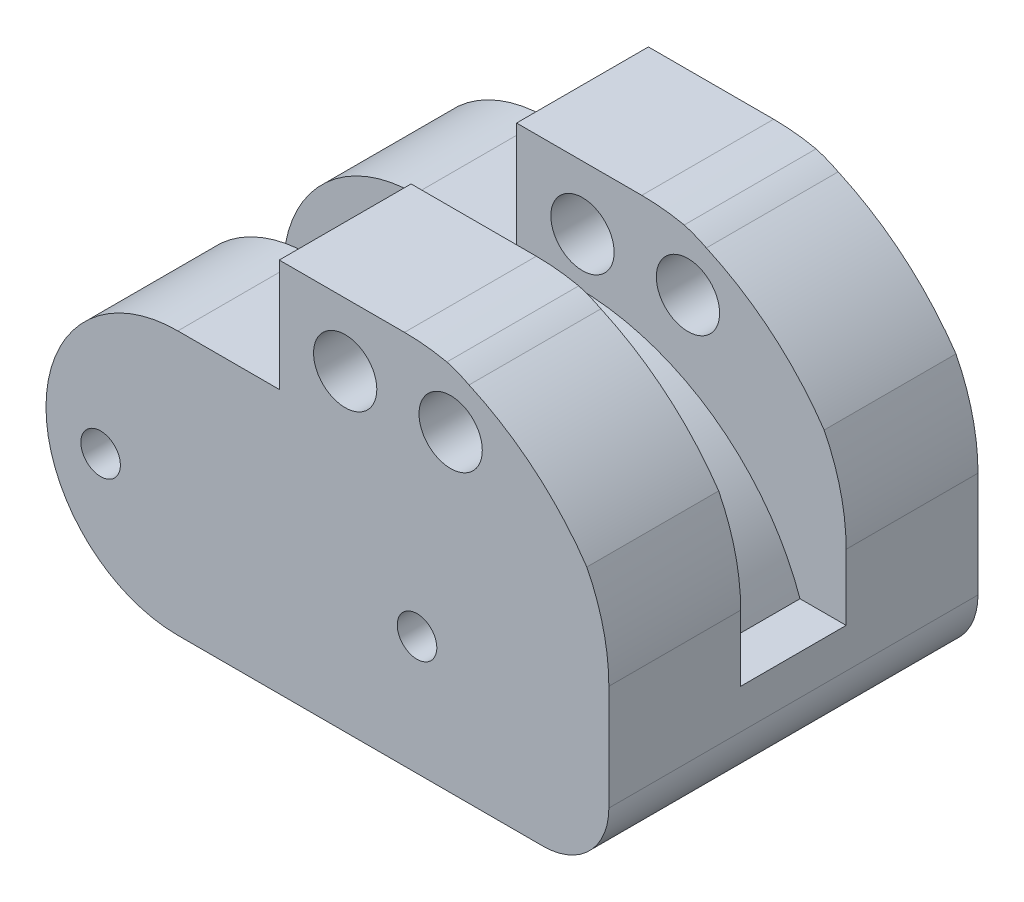
ISO-10303-21;
HEADER;
FILE_DESCRIPTION(('STEP AP214'),'2;1');
FILE_NAME('part.step','',(''),(''),'','','');
FILE_SCHEMA(('AUTOMOTIVE_DESIGN { 1 0 10303 214 1 1 1 1 }'));
ENDSEC;
DATA;
#1=APPLICATION_CONTEXT('core data for automotive mechanical design processes');
#2=APPLICATION_PROTOCOL_DEFINITION('international standard','automotive_design',2000,#1);
#3=PRODUCT_CONTEXT('',#1,'mechanical');
#4=PRODUCT('Part','Part','',(#3));
#5=PRODUCT_RELATED_PRODUCT_CATEGORY('part','',(#4));
#6=PRODUCT_DEFINITION_FORMATION('','',#4);
#7=PRODUCT_DEFINITION_CONTEXT('part definition',#1,'design');
#8=PRODUCT_DEFINITION('design','',#6,#7);
#9=PRODUCT_DEFINITION_SHAPE('','',#8);
#10=(LENGTH_UNIT() NAMED_UNIT(*) SI_UNIT(.MILLI.,.METRE.));
#11=(NAMED_UNIT(*) PLANE_ANGLE_UNIT() SI_UNIT($,.RADIAN.));
#12=(NAMED_UNIT(*) SI_UNIT($,.STERADIAN.) SOLID_ANGLE_UNIT());
#13=UNCERTAINTY_MEASURE_WITH_UNIT(LENGTH_MEASURE(1.E-05),#10,'distance_accuracy_value','');
#14=(GEOMETRIC_REPRESENTATION_CONTEXT(3) GLOBAL_UNCERTAINTY_ASSIGNED_CONTEXT((#13)) GLOBAL_UNIT_ASSIGNED_CONTEXT((#10,
#11,#12)) REPRESENTATION_CONTEXT('',''));
#15=CARTESIAN_POINT('',(0.,0.,0.));
#16=DIRECTION('',(0.,0.,1.));
#17=DIRECTION('',(1.,0.,0.));
#18=AXIS2_PLACEMENT_3D('',#15,#16,#17);
#19=CARTESIAN_POINT('',(0.,20.,0.));
#20=DIRECTION('',(0.,0.,-1.));
#21=DIRECTION('',(-1.,0.,0.));
#22=AXIS2_PLACEMENT_3D('',#19,#20,#21);
#23=PLANE('',#22);
#24=CARTESIAN_POINT('',(60.4498743710662,9.,0.));
#25=DIRECTION('',(0.,0.,-1.));
#26=DIRECTION('',(-1.,0.,0.));
#27=AXIS2_PLACEMENT_3D('',#24,#25,#26);
#28=CIRCLE('',#27,1.5);
#29=CARTESIAN_POINT('',(58.9498743710662,9.,0.));
#30=VERTEX_POINT('',#29);
#31=EDGE_CURVE('E511',#30,#30,#28,.T.);
#32=ORIENTED_EDGE('',*,*,#31,.T.);
#33=EDGE_LOOP('',(#32));
#34=FACE_BOUND('',#33,.T.);
#35=CARTESIAN_POINT('',(36.4498743710662,9.,0.));
#36=DIRECTION('',(0.,0.,-1.));
#37=DIRECTION('',(-1.,0.,0.));
#38=AXIS2_PLACEMENT_3D('',#35,#36,#37);
#39=CIRCLE('',#38,1.5);
#40=CARTESIAN_POINT('',(34.9498743710662,9.,0.));
#41=VERTEX_POINT('',#40);
#42=EDGE_CURVE('E518',#41,#41,#39,.T.);
#43=ORIENTED_EDGE('',*,*,#42,.T.);
#44=EDGE_LOOP('',(#43));
#45=FACE_BOUND('',#44,.T.);
#46=CARTESIAN_POINT('',(55.,23.7,0.));
#47=DIRECTION('',(0.,0.,1.));
#48=DIRECTION('',(1.,0.,0.));
#49=AXIS2_PLACEMENT_3D('',#46,#47,#48);
#50=CIRCLE('',#49,2.4);
#51=CARTESIAN_POINT('',(57.4,23.7,0.));
#52=VERTEX_POINT('',#51);
#53=EDGE_CURVE('E373',#52,#52,#50,.T.);
#54=ORIENTED_EDGE('',*,*,#53,.F.);
#55=EDGE_LOOP('',(#54));
#56=FACE_BOUND('',#55,.T.);
#57=CARTESIAN_POINT('',(63.,23.7,0.));
#58=DIRECTION('',(0.,0.,1.));
#59=DIRECTION('',(1.,0.,0.));
#60=AXIS2_PLACEMENT_3D('',#57,#58,#59);
#61=CIRCLE('',#60,2.4);
#62=CARTESIAN_POINT('',(65.4,23.7,0.));
#63=VERTEX_POINT('',#62);
#64=EDGE_CURVE('E378',#63,#63,#61,.T.);
#65=ORIENTED_EDGE('',*,*,#64,.F.);
#66=EDGE_LOOP('',(#65));
#67=FACE_BOUND('',#66,.T.);
#68=CARTESIAN_POINT('',(42.3077387473353,10.,0.));
#69=DIRECTION('',(0.,0.,-1.));
#70=DIRECTION('',(-1.,0.,0.));
#71=AXIS2_PLACEMENT_3D('',#68,#69,#70);
#72=CIRCLE('',#71,10.);
#73=CARTESIAN_POINT('',(42.3077387473353,20.,0.));
#74=VERTEX_POINT('',#73);
#75=CARTESIAN_POINT('',(32.3077387473353,10.,0.));
#76=VERTEX_POINT('',#75);
#77=EDGE_CURVE('E323',#74,#76,#72,.F.);
#78=ORIENTED_EDGE('',*,*,#77,.T.);
#79=CARTESIAN_POINT('',(42.3077387473353,10.,0.));
#80=DIRECTION('',(0.,0.,-1.));
#81=DIRECTION('',(-1.,0.,0.));
#82=AXIS2_PLACEMENT_3D('',#79,#80,#81);
#83=CIRCLE('',#82,10.);
#84=CARTESIAN_POINT('',(42.3077387473353,0.,0.));
#85=VERTEX_POINT('',#84);
#86=EDGE_CURVE('E325',#76,#85,#83,.F.);
#87=ORIENTED_EDGE('',*,*,#86,.T.);
#88=DIRECTION('',(1.,0.,0.));
#89=VECTOR('',#88,1.);
#90=CARTESIAN_POINT('',(0.,0.,0.));
#91=LINE('',#90,#89);
#92=CARTESIAN_POINT('',(70.,0.,0.));
#93=VERTEX_POINT('',#92);
#94=EDGE_CURVE('E413',#85,#93,#91,.T.);
#95=ORIENTED_EDGE('',*,*,#94,.T.);
#96=CARTESIAN_POINT('',(70.,5.,0.));
#97=DIRECTION('',(0.,0.,-1.));
#98=DIRECTION('',(-1.,0.,0.));
#99=AXIS2_PLACEMENT_3D('',#96,#97,#98);
#100=CIRCLE('',#99,5.);
#101=CARTESIAN_POINT('',(75.,5.,0.));
#102=VERTEX_POINT('',#101);
#103=EDGE_CURVE('E310',#93,#102,#100,.F.);
#104=ORIENTED_EDGE('',*,*,#103,.T.);
#105=DIRECTION('',(0.,-1.,0.));
#106=VECTOR('',#105,1.);
#107=CARTESIAN_POINT('',(75.,20.,0.));
#108=LINE('',#107,#106);
#109=CARTESIAN_POINT('',(75.,13.,0.));
#110=VERTEX_POINT('',#109);
#111=EDGE_CURVE('E421',#110,#102,#108,.T.);
#112=ORIENTED_EDGE('',*,*,#111,.F.);
#113=CARTESIAN_POINT('',(59.5,13.,0.));
#114=DIRECTION('',(0.,0.,-1.));
#115=DIRECTION('',(-1.,0.,0.));
#116=AXIS2_PLACEMENT_3D('',#113,#114,#115);
#117=CIRCLE('',#116,15.5);
#118=CARTESIAN_POINT('',(73.3293166859393,20.,0.));
#119=VERTEX_POINT('',#118);
#120=EDGE_CURVE('E448',#110,#119,#117,.F.);
#121=ORIENTED_EDGE('',*,*,#120,.T.);
#122=CARTESIAN_POINT('',(55.618124304324,7.95300600060694,0.));
#123=DIRECTION('',(0.,0.,1.));
#124=DIRECTION('',(1.,0.,0.));
#125=AXIS2_PLACEMENT_3D('',#122,#123,#124);
#126=CIRCLE('',#125,21.42);
#127=CARTESIAN_POINT('',(64.3962847495218,27.4916932440828,0.));
#128=VERTEX_POINT('',#127);
#129=EDGE_CURVE('E592',#119,#128,#126,.T.);
#130=ORIENTED_EDGE('',*,*,#129,.T.);
#131=CARTESIAN_POINT('',(60.1646583429696,19.3353416570303,0.));
#132=DIRECTION('',(0.,0.,-1.));
#133=DIRECTION('',(-1.,0.,0.));
#134=AXIS2_PLACEMENT_3D('',#131,#132,#133);
#135=CIRCLE('',#134,9.18872859846472);
#136=CARTESIAN_POINT('',(62.7168890542947,28.1625072073308,0.));
#137=VERTEX_POINT('',#136);
#138=EDGE_CURVE('E491',#128,#137,#135,.F.);
#139=ORIENTED_EDGE('',*,*,#138,.T.);
#140=CARTESIAN_POINT('',(59.5,28.5,0.));
#141=VERTEX_POINT('',#140);
#142=EDGE_CURVE('E487',#137,#141,#117,.F.);
#143=ORIENTED_EDGE('',*,*,#142,.T.);
#144=DIRECTION('',(1.,0.,0.));
#145=VECTOR('',#144,1.);
#146=CARTESIAN_POINT('',(0.,28.5,0.));
#147=LINE('',#146,#145);
#148=CARTESIAN_POINT('',(50.,28.5,0.));
#149=VERTEX_POINT('',#148);
#150=EDGE_CURVE('E404',#149,#141,#147,.T.);
#151=ORIENTED_EDGE('',*,*,#150,.F.);
#152=DIRECTION('',(0.,1.,0.));
#153=VECTOR('',#152,1.);
#154=CARTESIAN_POINT('',(50.,20.,0.));
#155=LINE('',#154,#153);
#156=CARTESIAN_POINT('',(50.,20.,0.));
#157=VERTEX_POINT('',#156);
#158=EDGE_CURVE('E355',#157,#149,#155,.T.);
#159=ORIENTED_EDGE('',*,*,#158,.F.);
#160=DIRECTION('',(1.,0.,0.));
#161=VECTOR('',#160,1.);
#162=CARTESIAN_POINT('',(0.,20.,0.));
#163=LINE('',#162,#161);
#164=EDGE_CURVE('E349',#74,#157,#163,.T.);
#165=ORIENTED_EDGE('',*,*,#164,.F.);
#166=EDGE_LOOP('',(#78,#87,#95,#104,#112,#121,#130,#139,#143,#151,#159,#165));
#167=FACE_BOUND('',#166,.T.);
#168=ADVANCED_FACE('F71',(#34,#45,#56,#67,#167),#23,.F.);
#169=CARTESIAN_POINT('',(0.,28.5,-10.));
#170=DIRECTION('',(0.,0.,1.));
#171=DIRECTION('',(1.,0.,0.));
#172=AXIS2_PLACEMENT_3D('',#169,#170,#171);
#173=PLANE('',#172);
#174=CARTESIAN_POINT('',(55.,23.7,-10.));
#175=DIRECTION('',(0.,0.,1.));
#176=DIRECTION('',(1.,0.,0.));
#177=AXIS2_PLACEMENT_3D('',#174,#175,#176);
#178=CIRCLE('',#177,2.4);
#179=CARTESIAN_POINT('',(57.4,23.7,-10.));
#180=VERTEX_POINT('',#179);
#181=EDGE_CURVE('E386',#180,#180,#178,.T.);
#182=ORIENTED_EDGE('',*,*,#181,.T.);
#183=EDGE_LOOP('',(#182));
#184=FACE_BOUND('',#183,.T.);
#185=CARTESIAN_POINT('',(63.,23.7,-10.));
#186=DIRECTION('',(0.,0.,1.));
#187=DIRECTION('',(1.,0.,0.));
#188=AXIS2_PLACEMENT_3D('',#185,#186,#187);
#189=CIRCLE('',#188,2.4);
#190=CARTESIAN_POINT('',(65.4,23.7,-10.));
#191=VERTEX_POINT('',#190);
#192=EDGE_CURVE('E390',#191,#191,#189,.T.);
#193=ORIENTED_EDGE('',*,*,#192,.T.);
#194=EDGE_LOOP('',(#193));
#195=FACE_BOUND('',#194,.T.);
#196=CARTESIAN_POINT('',(36.4498743710662,9.,-10.));
#197=DIRECTION('',(0.,0.,1.));
#198=DIRECTION('',(1.,0.,0.));
#199=AXIS2_PLACEMENT_3D('',#196,#197,#198);
#200=CIRCLE('',#199,1.5);
#201=CARTESIAN_POINT('',(37.9498743710662,9.,-10.));
#202=VERTEX_POINT('',#201);
#203=EDGE_CURVE('E514',#202,#202,#200,.T.);
#204=ORIENTED_EDGE('',*,*,#203,.T.);
#205=EDGE_LOOP('',(#204));
#206=FACE_BOUND('',#205,.T.);
#207=DIRECTION('',(-1.,0.,0.));
#208=VECTOR('',#207,1.);
#209=CARTESIAN_POINT('',(0.,0.,-9.99999999999999));
#210=LINE('',#209,#208);
#211=CARTESIAN_POINT('',(60.,0.,-10.));
#212=VERTEX_POINT('',#211);
#213=CARTESIAN_POINT('',(42.3077387473353,0.,-10.));
#214=VERTEX_POINT('',#213);
#215=EDGE_CURVE('E284',#212,#214,#210,.T.);
#216=ORIENTED_EDGE('',*,*,#215,.T.);
#217=CARTESIAN_POINT('',(42.3077387473353,10.,-10.));
#218=DIRECTION('',(0.,0.,1.));
#219=DIRECTION('',(1.,0.,0.));
#220=AXIS2_PLACEMENT_3D('',#217,#218,#219);
#221=CIRCLE('',#220,10.);
#222=CARTESIAN_POINT('',(32.3077387473353,10.,-10.));
#223=VERTEX_POINT('',#222);
#224=EDGE_CURVE('E93',#214,#223,#221,.F.);
#225=ORIENTED_EDGE('',*,*,#224,.T.);
#226=CARTESIAN_POINT('',(42.3077387473353,10.,-10.));
#227=DIRECTION('',(0.,0.,1.));
#228=DIRECTION('',(1.,0.,0.));
#229=AXIS2_PLACEMENT_3D('',#226,#227,#228);
#230=CIRCLE('',#229,10.);
#231=CARTESIAN_POINT('',(42.3077387473353,20.,-10.));
#232=VERTEX_POINT('',#231);
#233=EDGE_CURVE('E88',#223,#232,#230,.F.);
#234=ORIENTED_EDGE('',*,*,#233,.T.);
#235=DIRECTION('',(1.,0.,0.));
#236=VECTOR('',#235,1.);
#237=CARTESIAN_POINT('',(50.,20.,-10.));
#238=LINE('',#237,#236);
#239=CARTESIAN_POINT('',(50.,20.,-10.));
#240=VERTEX_POINT('',#239);
#241=EDGE_CURVE('E351',#232,#240,#238,.T.);
#242=ORIENTED_EDGE('',*,*,#241,.T.);
#243=DIRECTION('',(0.,-1.,0.));
#244=VECTOR('',#243,1.);
#245=CARTESIAN_POINT('',(50.,28.5,-10.));
#246=LINE('',#245,#244);
#247=CARTESIAN_POINT('',(50.,28.5,-10.));
#248=VERTEX_POINT('',#247);
#249=EDGE_CURVE('E361',#248,#240,#246,.T.);
#250=ORIENTED_EDGE('',*,*,#249,.F.);
#251=DIRECTION('',(-1.,0.,0.));
#252=VECTOR('',#251,1.);
#253=CARTESIAN_POINT('',(0.,28.5,-10.));
#254=LINE('',#253,#252);
#255=CARTESIAN_POINT('',(59.5,28.5,-10.));
#256=VERTEX_POINT('',#255);
#257=EDGE_CURVE('E407',#256,#248,#254,.T.);
#258=ORIENTED_EDGE('',*,*,#257,.F.);
#259=CARTESIAN_POINT('',(59.5,13.,-10.));
#260=DIRECTION('',(0.,0.,1.));
#261=DIRECTION('',(1.,0.,0.));
#262=AXIS2_PLACEMENT_3D('',#259,#260,#261);
#263=CIRCLE('',#262,15.5);
#264=CARTESIAN_POINT('',(62.7168890542947,28.1625072073308,-10.));
#265=VERTEX_POINT('',#264);
#266=EDGE_CURVE('E464',#256,#265,#263,.F.);
#267=ORIENTED_EDGE('',*,*,#266,.T.);
#268=CARTESIAN_POINT('',(60.1646583429696,19.3353416570303,-10.));
#269=DIRECTION('',(0.,0.,1.));
#270=DIRECTION('',(1.,0.,0.));
#271=AXIS2_PLACEMENT_3D('',#268,#269,#270);
#272=CIRCLE('',#271,9.18872859846472);
#273=CARTESIAN_POINT('',(64.3962847495218,27.4916932440828,-10.));
#274=VERTEX_POINT('',#273);
#275=EDGE_CURVE('E508',#265,#274,#272,.F.);
#276=ORIENTED_EDGE('',*,*,#275,.T.);
#277=CARTESIAN_POINT('',(55.618124304324,7.95300600060694,-10.));
#278=DIRECTION('',(0.,0.,1.));
#279=DIRECTION('',(1.,0.,0.));
#280=AXIS2_PLACEMENT_3D('',#277,#278,#279);
#281=CIRCLE('',#280,21.42);
#282=CARTESIAN_POINT('',(73.3293166859393,20.,-10.));
#283=VERTEX_POINT('',#282);
#284=EDGE_CURVE('E552',#283,#274,#281,.T.);
#285=ORIENTED_EDGE('',*,*,#284,.F.);
#286=CARTESIAN_POINT('',(75.,13.,-10.));
#287=VERTEX_POINT('',#286);
#288=EDGE_CURVE('E486',#283,#287,#263,.F.);
#289=ORIENTED_EDGE('',*,*,#288,.T.);
#290=DIRECTION('',(0.,-1.,0.));
#291=VECTOR('',#290,1.);
#292=CARTESIAN_POINT('',(75.,28.5,-10.));
#293=LINE('',#292,#291);
#294=CARTESIAN_POINT('',(75.,8.,-10.));
#295=VERTEX_POINT('',#294);
#296=EDGE_CURVE('E409',#287,#295,#293,.T.);
#297=ORIENTED_EDGE('',*,*,#296,.T.);
#298=DIRECTION('',(1.,0.,0.));
#299=VECTOR('',#298,1.);
#300=CARTESIAN_POINT('',(75.,8.,-10.));
#301=LINE('',#300,#299);
#302=CARTESIAN_POINT('',(71.5,8.,-10.));
#303=VERTEX_POINT('',#302);
#304=EDGE_CURVE('E370',#303,#295,#301,.T.);
#305=ORIENTED_EDGE('',*,*,#304,.F.);
#306=CARTESIAN_POINT('',(54.5294372515229,2.,-10.));
#307=DIRECTION('',(0.,0.,1.));
#308=DIRECTION('',(1.,0.,0.));
#309=AXIS2_PLACEMENT_3D('',#306,#307,#308);
#310=CIRCLE('',#309,18.);
#311=CARTESIAN_POINT('',(54.5294372515229,20.,-10.));
#312=VERTEX_POINT('',#311);
#313=EDGE_CURVE('E431',#303,#312,#310,.T.);
#314=ORIENTED_EDGE('',*,*,#313,.T.);
#315=DIRECTION('',(-1.,0.,0.));
#316=VECTOR('',#315,1.);
#317=CARTESIAN_POINT('',(0.,20.,-10.));
#318=LINE('',#317,#316);
#319=CARTESIAN_POINT('',(53.,20.,-10.));
#320=VERTEX_POINT('',#319);
#321=EDGE_CURVE('E403',#312,#320,#318,.T.);
#322=ORIENTED_EDGE('',*,*,#321,.T.);
#323=CARTESIAN_POINT('',(53.,17.,-10.));
#324=DIRECTION('',(0.,0.,1.));
#325=DIRECTION('',(1.,0.,0.));
#326=AXIS2_PLACEMENT_3D('',#323,#324,#325);
#327=CIRCLE('',#326,3.);
#328=CARTESIAN_POINT('',(50.,17.,-10.));
#329=VERTEX_POINT('',#328);
#330=EDGE_CURVE('E299',#320,#329,#327,.T.);
#331=ORIENTED_EDGE('',*,*,#330,.T.);
#332=DIRECTION('',(0.,1.,0.));
#333=VECTOR('',#332,1.);
#334=CARTESIAN_POINT('',(50.,-0.499999999999997,-10.));
#335=LINE('',#334,#333);
#336=CARTESIAN_POINT('',(50.,10.,-10.));
#337=VERTEX_POINT('',#336);
#338=EDGE_CURVE('E439',#337,#329,#335,.T.);
#339=ORIENTED_EDGE('',*,*,#338,.F.);
#340=CARTESIAN_POINT('',(60.,10.,-10.));
#341=DIRECTION('',(0.,0.,1.));
#342=DIRECTION('',(1.,0.,0.));
#343=AXIS2_PLACEMENT_3D('',#340,#341,#342);
#344=CIRCLE('',#343,10.);
#345=EDGE_CURVE('E286',#337,#212,#344,.T.);
#346=ORIENTED_EDGE('',*,*,#345,.T.);
#347=EDGE_LOOP('',(#216,#225,#234,#242,#250,#258,#267,#276,#285,#289,#297,#305,#314,#322,#331,
#339,#346));
#348=FACE_BOUND('',#347,.T.);
#349=ADVANCED_FACE('F437',(#184,#195,#206,#348),#173,.F.);
#350=CARTESIAN_POINT('',(0.,28.5,-18.));
#351=DIRECTION('',(0.,0.,-1.));
#352=DIRECTION('',(-1.,0.,0.));
#353=AXIS2_PLACEMENT_3D('',#350,#351,#352);
#354=PLANE('',#353);
#355=CARTESIAN_POINT('',(55.,23.7,-18.));
#356=DIRECTION('',(0.,0.,-1.));
#357=DIRECTION('',(-1.,0.,0.));
#358=AXIS2_PLACEMENT_3D('',#355,#356,#357);
#359=CIRCLE('',#358,2.4);
#360=CARTESIAN_POINT('',(52.6,23.7,-18.));
#361=VERTEX_POINT('',#360);
#362=EDGE_CURVE('E377',#361,#361,#359,.T.);
#363=ORIENTED_EDGE('',*,*,#362,.T.);
#364=EDGE_LOOP('',(#363));
#365=FACE_BOUND('',#364,.T.);
#366=CARTESIAN_POINT('',(63.,23.7,-18.));
#367=DIRECTION('',(0.,0.,-1.));
#368=DIRECTION('',(-1.,0.,0.));
#369=AXIS2_PLACEMENT_3D('',#366,#367,#368);
#370=CIRCLE('',#369,2.4);
#371=CARTESIAN_POINT('',(60.6,23.7,-18.));
#372=VERTEX_POINT('',#371);
#373=EDGE_CURVE('E389',#372,#372,#370,.T.);
#374=ORIENTED_EDGE('',*,*,#373,.T.);
#375=EDGE_LOOP('',(#374));
#376=FACE_BOUND('',#375,.T.);
#377=CARTESIAN_POINT('',(36.4498743710662,9.,-18.));
#378=DIRECTION('',(0.,0.,1.));
#379=DIRECTION('',(1.,0.,0.));
#380=AXIS2_PLACEMENT_3D('',#377,#378,#379);
#381=CIRCLE('',#380,1.5);
#382=CARTESIAN_POINT('',(37.9498743710662,9.,-18.));
#383=VERTEX_POINT('',#382);
#384=EDGE_CURVE('E331',#383,#383,#381,.T.);
#385=ORIENTED_EDGE('',*,*,#384,.F.);
#386=EDGE_LOOP('',(#385));
#387=FACE_BOUND('',#386,.T.);
#388=CARTESIAN_POINT('',(42.3077387473353,10.,-18.));
#389=DIRECTION('',(0.,0.,-1.));
#390=DIRECTION('',(-1.,0.,0.));
#391=AXIS2_PLACEMENT_3D('',#388,#389,#390);
#392=CIRCLE('',#391,10.);
#393=CARTESIAN_POINT('',(42.3077387473353,20.,-18.));
#394=VERTEX_POINT('',#393);
#395=CARTESIAN_POINT('',(32.3077387473353,10.,-18.));
#396=VERTEX_POINT('',#395);
#397=EDGE_CURVE('E312',#394,#396,#392,.F.);
#398=ORIENTED_EDGE('',*,*,#397,.T.);
#399=CARTESIAN_POINT('',(42.3077387473353,10.,-18.));
#400=DIRECTION('',(0.,0.,-1.));
#401=DIRECTION('',(-1.,0.,0.));
#402=AXIS2_PLACEMENT_3D('',#399,#400,#401);
#403=CIRCLE('',#402,10.);
#404=CARTESIAN_POINT('',(42.3077387473353,0.,-18.));
#405=VERTEX_POINT('',#404);
#406=EDGE_CURVE('E266',#396,#405,#403,.F.);
#407=ORIENTED_EDGE('',*,*,#406,.T.);
#408=DIRECTION('',(1.,0.,0.));
#409=VECTOR('',#408,1.);
#410=CARTESIAN_POINT('',(10.,0.,-18.));
#411=LINE('',#410,#409);
#412=CARTESIAN_POINT('',(60.,0.,-18.));
#413=VERTEX_POINT('',#412);
#414=EDGE_CURVE('E260',#405,#413,#411,.T.);
#415=ORIENTED_EDGE('',*,*,#414,.T.);
#416=CARTESIAN_POINT('',(60.0000000000001,10.0000000000001,-18.));
#417=DIRECTION('',(0.,0.,-1.));
#418=DIRECTION('',(-1.,0.,0.));
#419=AXIS2_PLACEMENT_3D('',#416,#417,#418);
#420=CIRCLE('',#419,10.0000000000001);
#421=CARTESIAN_POINT('',(50.,10.0000000000001,-18.));
#422=VERTEX_POINT('',#421);
#423=EDGE_CURVE('E263',#413,#422,#420,.T.);
#424=ORIENTED_EDGE('',*,*,#423,.T.);
#425=DIRECTION('',(0.,-1.,0.));
#426=VECTOR('',#425,1.);
#427=CARTESIAN_POINT('',(50.,20.,-18.));
#428=LINE('',#427,#426);
#429=CARTESIAN_POINT('',(50.,17.,-18.));
#430=VERTEX_POINT('',#429);
#431=EDGE_CURVE('E280',#430,#422,#428,.T.);
#432=ORIENTED_EDGE('',*,*,#431,.F.);
#433=CARTESIAN_POINT('',(53.,17.,-18.));
#434=DIRECTION('',(0.,0.,-1.));
#435=DIRECTION('',(-1.,0.,0.));
#436=AXIS2_PLACEMENT_3D('',#433,#434,#435);
#437=CIRCLE('',#436,3.);
#438=CARTESIAN_POINT('',(53.,20.,-18.));
#439=VERTEX_POINT('',#438);
#440=EDGE_CURVE('E297',#430,#439,#437,.T.);
#441=ORIENTED_EDGE('',*,*,#440,.T.);
#442=DIRECTION('',(1.,0.,0.));
#443=VECTOR('',#442,1.);
#444=CARTESIAN_POINT('',(0.,20.,-18.));
#445=LINE('',#444,#443);
#446=CARTESIAN_POINT('',(54.5294372515229,20.,-18.));
#447=VERTEX_POINT('',#446);
#448=EDGE_CURVE('E393',#439,#447,#445,.T.);
#449=ORIENTED_EDGE('',*,*,#448,.T.);
#450=CARTESIAN_POINT('',(54.5294372515229,2.,-18.));
#451=DIRECTION('',(0.,0.,-1.));
#452=DIRECTION('',(-1.,0.,0.));
#453=AXIS2_PLACEMENT_3D('',#450,#451,#452);
#454=CIRCLE('',#453,18.);
#455=CARTESIAN_POINT('',(71.5,8.,-18.));
#456=VERTEX_POINT('',#455);
#457=EDGE_CURVE('E433',#447,#456,#454,.T.);
#458=ORIENTED_EDGE('',*,*,#457,.T.);
#459=DIRECTION('',(-1.,0.,0.));
#460=VECTOR('',#459,1.);
#461=CARTESIAN_POINT('',(75.,8.,-18.));
#462=LINE('',#461,#460);
#463=CARTESIAN_POINT('',(75.,8.,-18.));
#464=VERTEX_POINT('',#463);
#465=EDGE_CURVE('E359',#464,#456,#462,.T.);
#466=ORIENTED_EDGE('',*,*,#465,.F.);
#467=DIRECTION('',(0.,-1.,0.));
#468=VECTOR('',#467,1.);
#469=CARTESIAN_POINT('',(75.,28.5,-18.));
#470=LINE('',#469,#468);
#471=CARTESIAN_POINT('',(75.,13.,-18.));
#472=VERTEX_POINT('',#471);
#473=EDGE_CURVE('E400',#472,#464,#470,.T.);
#474=ORIENTED_EDGE('',*,*,#473,.F.);
#475=CARTESIAN_POINT('',(59.5,13.,-18.));
#476=DIRECTION('',(0.,0.,-1.));
#477=DIRECTION('',(-1.,0.,0.));
#478=AXIS2_PLACEMENT_3D('',#475,#476,#477);
#479=CIRCLE('',#478,15.5);
#480=CARTESIAN_POINT('',(73.3293166859393,20.,-18.));
#481=VERTEX_POINT('',#480);
#482=EDGE_CURVE('E475',#472,#481,#479,.F.);
#483=ORIENTED_EDGE('',*,*,#482,.T.);
#484=CARTESIAN_POINT('',(55.618124304324,7.95300600060694,-18.));
#485=DIRECTION('',(0.,0.,-1.));
#486=DIRECTION('',(-1.,0.,0.));
#487=AXIS2_PLACEMENT_3D('',#484,#485,#486);
#488=CIRCLE('',#487,21.42);
#489=CARTESIAN_POINT('',(64.3962847495219,27.4916932440827,-18.));
#490=VERTEX_POINT('',#489);
#491=EDGE_CURVE('E543',#481,#490,#488,.F.);
#492=ORIENTED_EDGE('',*,*,#491,.T.);
#493=CARTESIAN_POINT('',(60.1646583429696,19.3353416570303,-18.));
#494=DIRECTION('',(0.,0.,-1.));
#495=DIRECTION('',(-1.,0.,0.));
#496=AXIS2_PLACEMENT_3D('',#493,#494,#495);
#497=CIRCLE('',#496,9.18872859846472);
#498=CARTESIAN_POINT('',(62.7168890542947,28.1625072073308,-18.));
#499=VERTEX_POINT('',#498);
#500=EDGE_CURVE('E506',#490,#499,#497,.F.);
#501=ORIENTED_EDGE('',*,*,#500,.T.);
#502=CARTESIAN_POINT('',(59.5,28.5,-18.));
#503=VERTEX_POINT('',#502);
#504=EDGE_CURVE('E472',#499,#503,#479,.F.);
#505=ORIENTED_EDGE('',*,*,#504,.T.);
#506=DIRECTION('',(1.,0.,0.));
#507=VECTOR('',#506,1.);
#508=CARTESIAN_POINT('',(0.,28.5,-18.));
#509=LINE('',#508,#507);
#510=CARTESIAN_POINT('',(50.,28.5,-18.));
#511=VERTEX_POINT('',#510);
#512=EDGE_CURVE('E394',#511,#503,#509,.T.);
#513=ORIENTED_EDGE('',*,*,#512,.F.);
#514=DIRECTION('',(0.,1.,0.));
#515=VECTOR('',#514,1.);
#516=CARTESIAN_POINT('',(50.,28.5,-18.));
#517=LINE('',#516,#515);
#518=CARTESIAN_POINT('',(50.,20.,-18.));
#519=VERTEX_POINT('',#518);
#520=EDGE_CURVE('E455',#519,#511,#517,.T.);
#521=ORIENTED_EDGE('',*,*,#520,.F.);
#522=DIRECTION('',(-1.,0.,0.));
#523=VECTOR('',#522,1.);
#524=CARTESIAN_POINT('',(50.,20.,-18.));
#525=LINE('',#524,#523);
#526=EDGE_CURVE('E271',#519,#394,#525,.T.);
#527=ORIENTED_EDGE('',*,*,#526,.T.);
#528=EDGE_LOOP('',(#398,#407,#415,#424,#432,#441,#449,#458,#466,#474,#483,#492,#501,#505,#513,
#521,#527));
#529=FACE_BOUND('',#528,.T.);
#530=ADVANCED_FACE('F262',(#365,#376,#387,#529),#354,.F.);
#531=CARTESIAN_POINT('',(0.,20.,-28.));
#532=DIRECTION('',(0.,0.,1.));
#533=DIRECTION('',(1.,0.,0.));
#534=AXIS2_PLACEMENT_3D('',#531,#532,#533);
#535=PLANE('',#534);
#536=CARTESIAN_POINT('',(60.4498743710662,9.,-28.));
#537=DIRECTION('',(0.,0.,-1.));
#538=DIRECTION('',(-1.,0.,0.));
#539=AXIS2_PLACEMENT_3D('',#536,#537,#538);
#540=CIRCLE('',#539,1.5);
#541=CARTESIAN_POINT('',(58.9498743710662,9.,-28.));
#542=VERTEX_POINT('',#541);
#543=EDGE_CURVE('E515',#542,#542,#540,.T.);
#544=ORIENTED_EDGE('',*,*,#543,.F.);
#545=EDGE_LOOP('',(#544));
#546=FACE_BOUND('',#545,.T.);
#547=CARTESIAN_POINT('',(36.4498743710662,9.,-28.));
#548=DIRECTION('',(0.,0.,-1.));
#549=DIRECTION('',(-1.,0.,0.));
#550=AXIS2_PLACEMENT_3D('',#547,#548,#549);
#551=CIRCLE('',#550,1.5);
#552=CARTESIAN_POINT('',(34.9498743710662,9.,-28.));
#553=VERTEX_POINT('',#552);
#554=EDGE_CURVE('E510',#553,#553,#551,.T.);
#555=ORIENTED_EDGE('',*,*,#554,.F.);
#556=EDGE_LOOP('',(#555));
#557=FACE_BOUND('',#556,.T.);
#558=CARTESIAN_POINT('',(63.,23.7,-28.));
#559=DIRECTION('',(0.,0.,1.));
#560=DIRECTION('',(1.,0.,0.));
#561=AXIS2_PLACEMENT_3D('',#558,#559,#560);
#562=CIRCLE('',#561,2.4);
#563=CARTESIAN_POINT('',(65.4,23.7,-28.));
#564=VERTEX_POINT('',#563);
#565=EDGE_CURVE('E374',#564,#564,#562,.T.);
#566=ORIENTED_EDGE('',*,*,#565,.T.);
#567=EDGE_LOOP('',(#566));
#568=FACE_BOUND('',#567,.T.);
#569=CARTESIAN_POINT('',(55.,23.7,-28.));
#570=DIRECTION('',(0.,0.,1.));
#571=DIRECTION('',(1.,0.,0.));
#572=AXIS2_PLACEMENT_3D('',#569,#570,#571);
#573=CIRCLE('',#572,2.4);
#574=CARTESIAN_POINT('',(57.4,23.7,-28.));
#575=VERTEX_POINT('',#574);
#576=EDGE_CURVE('E381',#575,#575,#573,.T.);
#577=ORIENTED_EDGE('',*,*,#576,.T.);
#578=EDGE_LOOP('',(#577));
#579=FACE_BOUND('',#578,.T.);
#580=DIRECTION('',(-1.,0.,0.));
#581=VECTOR('',#580,1.);
#582=CARTESIAN_POINT('',(0.,0.,-28.));
#583=LINE('',#582,#581);
#584=CARTESIAN_POINT('',(70.,0.,-28.));
#585=VERTEX_POINT('',#584);
#586=CARTESIAN_POINT('',(42.3077387473353,0.,-28.));
#587=VERTEX_POINT('',#586);
#588=EDGE_CURVE('E415',#585,#587,#583,.T.);
#589=ORIENTED_EDGE('',*,*,#588,.T.);
#590=CARTESIAN_POINT('',(42.3077387473353,10.,-28.));
#591=DIRECTION('',(0.,0.,1.));
#592=DIRECTION('',(1.,0.,0.));
#593=AXIS2_PLACEMENT_3D('',#590,#591,#592);
#594=CIRCLE('',#593,10.);
#595=CARTESIAN_POINT('',(32.3077387473353,10.,-28.));
#596=VERTEX_POINT('',#595);
#597=EDGE_CURVE('E321',#587,#596,#594,.F.);
#598=ORIENTED_EDGE('',*,*,#597,.T.);
#599=CARTESIAN_POINT('',(42.3077387473353,10.,-28.));
#600=DIRECTION('',(0.,0.,1.));
#601=DIRECTION('',(1.,0.,0.));
#602=AXIS2_PLACEMENT_3D('',#599,#600,#601);
#603=CIRCLE('',#602,10.);
#604=CARTESIAN_POINT('',(42.3077387473353,20.,-28.));
#605=VERTEX_POINT('',#604);
#606=EDGE_CURVE('E319',#596,#605,#603,.F.);
#607=ORIENTED_EDGE('',*,*,#606,.T.);
#608=DIRECTION('',(1.,0.,0.));
#609=VECTOR('',#608,1.);
#610=CARTESIAN_POINT('',(10.,20.,-28.));
#611=LINE('',#610,#609);
#612=CARTESIAN_POINT('',(50.,20.,-28.));
#613=VERTEX_POINT('',#612);
#614=EDGE_CURVE('E596',#605,#613,#611,.T.);
#615=ORIENTED_EDGE('',*,*,#614,.T.);
#616=DIRECTION('',(0.,1.,0.));
#617=VECTOR('',#616,1.);
#618=CARTESIAN_POINT('',(50.,20.,-28.));
#619=LINE('',#618,#617);
#620=CARTESIAN_POINT('',(50.,28.5,-28.));
#621=VERTEX_POINT('',#620);
#622=EDGE_CURVE('E564',#613,#621,#619,.T.);
#623=ORIENTED_EDGE('',*,*,#622,.T.);
#624=DIRECTION('',(-1.,0.,0.));
#625=VECTOR('',#624,1.);
#626=CARTESIAN_POINT('',(0.,28.5,-28.));
#627=LINE('',#626,#625);
#628=CARTESIAN_POINT('',(59.5,28.5,-28.));
#629=VERTEX_POINT('',#628);
#630=EDGE_CURVE('E397',#629,#621,#627,.T.);
#631=ORIENTED_EDGE('',*,*,#630,.F.);
#632=CARTESIAN_POINT('',(59.5,13.,-28.));
#633=DIRECTION('',(0.,0.,-1.));
#634=DIRECTION('',(-1.,0.,0.));
#635=AXIS2_PLACEMENT_3D('',#632,#633,#634);
#636=CIRCLE('',#635,15.5);
#637=CARTESIAN_POINT('',(62.7168890542948,28.1625072073308,-28.));
#638=VERTEX_POINT('',#637);
#639=EDGE_CURVE('E523',#638,#629,#636,.F.);
#640=ORIENTED_EDGE('',*,*,#639,.F.);
#641=CARTESIAN_POINT('',(60.1646583429696,19.3353416570303,-28.));
#642=DIRECTION('',(0.,0.,-1.));
#643=DIRECTION('',(-1.,0.,0.));
#644=AXIS2_PLACEMENT_3D('',#641,#642,#643);
#645=CIRCLE('',#644,9.18872859846472);
#646=CARTESIAN_POINT('',(64.3962847495219,27.4916932440828,-28.));
#647=VERTEX_POINT('',#646);
#648=EDGE_CURVE('E545',#647,#638,#645,.F.);
#649=ORIENTED_EDGE('',*,*,#648,.F.);
#650=CARTESIAN_POINT('',(55.618124304324,7.95300600060694,-28.));
#651=DIRECTION('',(0.,0.,-1.));
#652=DIRECTION('',(-1.,0.,0.));
#653=AXIS2_PLACEMENT_3D('',#650,#651,#652);
#654=CIRCLE('',#653,21.42);
#655=CARTESIAN_POINT('',(73.3293166859393,20.,-28.));
#656=VERTEX_POINT('',#655);
#657=EDGE_CURVE('E541',#656,#647,#654,.F.);
#658=ORIENTED_EDGE('',*,*,#657,.F.);
#659=CARTESIAN_POINT('',(75.,13.,-28.));
#660=VERTEX_POINT('',#659);
#661=EDGE_CURVE('E481',#660,#656,#636,.F.);
#662=ORIENTED_EDGE('',*,*,#661,.F.);
#663=DIRECTION('',(0.,-1.,0.));
#664=VECTOR('',#663,1.);
#665=CARTESIAN_POINT('',(75.,20.,-28.));
#666=LINE('',#665,#664);
#667=CARTESIAN_POINT('',(75.,5.,-28.));
#668=VERTEX_POINT('',#667);
#669=EDGE_CURVE('E418',#660,#668,#666,.T.);
#670=ORIENTED_EDGE('',*,*,#669,.T.);
#671=CARTESIAN_POINT('',(70.,5.,-28.));
#672=DIRECTION('',(0.,0.,1.));
#673=DIRECTION('',(1.,0.,0.));
#674=AXIS2_PLACEMENT_3D('',#671,#672,#673);
#675=CIRCLE('',#674,5.);
#676=EDGE_CURVE('E305',#668,#585,#675,.F.);
#677=ORIENTED_EDGE('',*,*,#676,.T.);
#678=EDGE_LOOP('',(#589,#598,#607,#615,#623,#631,#640,#649,#658,#662,#670,#677));
#679=FACE_BOUND('',#678,.T.);
#680=ADVANCED_FACE('F544',(#546,#557,#568,#579,#679),#535,.F.);
#681=CARTESIAN_POINT('',(0.,20.,0.));
#682=DIRECTION('',(0.,-1.,0.));
#683=DIRECTION('',(0.,0.,-1.));
#684=AXIS2_PLACEMENT_3D('',#681,#682,#683);
#685=PLANE('',#684);
#686=ORIENTED_EDGE('',*,*,#241,.F.);
#687=DIRECTION('',(0.,0.,1.));
#688=VECTOR('',#687,1.);
#689=CARTESIAN_POINT('',(42.3077387473353,20.,0.));
#690=LINE('',#689,#688);
#691=EDGE_CURVE('E12',#232,#74,#690,.T.);
#692=ORIENTED_EDGE('',*,*,#691,.T.);
#693=ORIENTED_EDGE('',*,*,#164,.T.);
#694=DIRECTION('',(0.,0.,-1.));
#695=VECTOR('',#694,1.);
#696=CARTESIAN_POINT('',(50.,20.,0.500000000000004));
#697=LINE('',#696,#695);
#698=EDGE_CURVE('E454',#157,#240,#697,.T.);
#699=ORIENTED_EDGE('',*,*,#698,.T.);
#700=EDGE_LOOP('',(#686,#692,#693,#699));
#701=FACE_BOUND('',#700,.T.);
#702=ADVANCED_FACE('F347',(#701),#685,.F.);
#703=ORIENTED_EDGE('',*,*,#614,.F.);
#704=DIRECTION('',(0.,0.,1.));
#705=VECTOR('',#704,1.);
#706=CARTESIAN_POINT('',(42.3077387473353,20.,0.));
#707=LINE('',#706,#705);
#708=EDGE_CURVE('E80',#605,#394,#707,.T.);
#709=ORIENTED_EDGE('',*,*,#708,.T.);
#710=ORIENTED_EDGE('',*,*,#526,.F.);
#711=EDGE_CURVE('E446',#519,#613,#697,.T.);
#712=ORIENTED_EDGE('',*,*,#711,.T.);
#713=EDGE_LOOP('',(#703,#709,#710,#712));
#714=FACE_BOUND('',#713,.T.);
#715=ADVANCED_FACE('F610',(#714),#685,.F.);
#716=CARTESIAN_POINT('',(0.,0.,0.));
#717=DIRECTION('',(0.,-1.,0.));
#718=DIRECTION('',(0.,0.,-1.));
#719=AXIS2_PLACEMENT_3D('',#716,#717,#718);
#720=PLANE('',#719);
#721=ORIENTED_EDGE('',*,*,#414,.F.);
#722=DIRECTION('',(0.,0.,-1.));
#723=VECTOR('',#722,1.);
#724=CARTESIAN_POINT('',(42.3077387473353,0.,-28.));
#725=LINE('',#724,#723);
#726=EDGE_CURVE('E317',#405,#587,#725,.T.);
#727=ORIENTED_EDGE('',*,*,#726,.T.);
#728=ORIENTED_EDGE('',*,*,#588,.F.);
#729=DIRECTION('',(0.,0.,-1.));
#730=VECTOR('',#729,1.);
#731=CARTESIAN_POINT('',(70.,0.,0.));
#732=LINE('',#731,#730);
#733=EDGE_CURVE('E307',#585,#93,#732,.F.);
#734=ORIENTED_EDGE('',*,*,#733,.T.);
#735=ORIENTED_EDGE('',*,*,#94,.F.);
#736=DIRECTION('',(0.,0.,-1.));
#737=VECTOR('',#736,1.);
#738=CARTESIAN_POINT('',(42.3077387473353,0.,-10.));
#739=LINE('',#738,#737);
#740=EDGE_CURVE('E315',#85,#214,#739,.T.);
#741=ORIENTED_EDGE('',*,*,#740,.T.);
#742=ORIENTED_EDGE('',*,*,#215,.F.);
#743=DIRECTION('',(0.,0.,1.));
#744=VECTOR('',#743,1.);
#745=CARTESIAN_POINT('',(60.,0.,0.));
#746=LINE('',#745,#744);
#747=EDGE_CURVE('E278',#212,#413,#746,.F.);
#748=ORIENTED_EDGE('',*,*,#747,.T.);
#749=EDGE_LOOP('',(#721,#727,#728,#734,#735,#741,#742,#748));
#750=FACE_BOUND('',#749,.T.);
#751=ADVANCED_FACE('F282',(#750),#720,.T.);
#752=CARTESIAN_POINT('',(50.,28.5,0.500000000000004));
#753=DIRECTION('',(-1.,0.,0.));
#754=DIRECTION('',(0.,0.,1.));
#755=AXIS2_PLACEMENT_3D('',#752,#753,#754);
#756=PLANE('',#755);
#757=ORIENTED_EDGE('',*,*,#711,.F.);
#758=ORIENTED_EDGE('',*,*,#520,.T.);
#759=DIRECTION('',(0.,0.,1.));
#760=VECTOR('',#759,1.);
#761=CARTESIAN_POINT('',(50.,28.5,0.));
#762=LINE('',#761,#760);
#763=EDGE_CURVE('E435',#621,#511,#762,.T.);
#764=ORIENTED_EDGE('',*,*,#763,.F.);
#765=ORIENTED_EDGE('',*,*,#622,.F.);
#766=EDGE_LOOP('',(#757,#758,#764,#765));
#767=FACE_BOUND('',#766,.T.);
#768=ADVANCED_FACE('F612',(#767),#756,.T.);
#769=CARTESIAN_POINT('',(60.1646583429696,19.3353416570303,0.));
#770=DIRECTION('',(0.,0.,-1.));
#771=DIRECTION('',(-1.,0.,0.));
#772=AXIS2_PLACEMENT_3D('',#769,#770,#771);
#773=CYLINDRICAL_SURFACE('',#772,9.18872859846472);
#774=DIRECTION('',(0.,0.,-1.));
#775=VECTOR('',#774,1.);
#776=CARTESIAN_POINT('',(64.3962847495219,27.4916932440828,-18.));
#777=LINE('',#776,#775);
#778=EDGE_CURVE('E549',#490,#647,#777,.T.);
#779=ORIENTED_EDGE('',*,*,#778,.T.);
#780=ORIENTED_EDGE('',*,*,#648,.T.);
#781=DIRECTION('',(0.,0.,-1.));
#782=VECTOR('',#781,1.);
#783=CARTESIAN_POINT('',(62.7168890542947,28.1625072073308,0.));
#784=LINE('',#783,#782);
#785=EDGE_CURVE('E498',#499,#638,#784,.T.);
#786=ORIENTED_EDGE('',*,*,#785,.F.);
#787=ORIENTED_EDGE('',*,*,#500,.F.);
#788=EDGE_LOOP('',(#779,#780,#786,#787));
#789=FACE_BOUND('',#788,.T.);
#790=ADVANCED_FACE('F558',(#789),#773,.T.);
#791=CARTESIAN_POINT('',(59.5,13.,0.500000000000004));
#792=DIRECTION('',(0.,0.,-1.));
#793=DIRECTION('',(-1.,0.,0.));
#794=AXIS2_PLACEMENT_3D('',#791,#792,#793);
#795=CYLINDRICAL_SURFACE('',#794,15.5);
#796=DIRECTION('',(0.,0.,-1.));
#797=VECTOR('',#796,1.);
#798=CARTESIAN_POINT('',(73.3293166859393,20.,0.));
#799=LINE('',#798,#797);
#800=EDGE_CURVE('E497',#481,#656,#799,.T.);
#801=ORIENTED_EDGE('',*,*,#800,.F.);
#802=ORIENTED_EDGE('',*,*,#482,.F.);
#803=DIRECTION('',(0.,0.,-1.));
#804=VECTOR('',#803,1.);
#805=CARTESIAN_POINT('',(75.,13.,0.500000000000004));
#806=LINE('',#805,#804);
#807=EDGE_CURVE('E483',#472,#660,#806,.T.);
#808=ORIENTED_EDGE('',*,*,#807,.T.);
#809=ORIENTED_EDGE('',*,*,#661,.T.);
#810=EDGE_LOOP('',(#801,#802,#808,#809));
#811=FACE_BOUND('',#810,.T.);
#812=ADVANCED_FACE('F531',(#811),#795,.T.);
#813=EDGE_CURVE('E501',#119,#283,#799,.T.);
#814=ORIENTED_EDGE('',*,*,#813,.F.);
#815=ORIENTED_EDGE('',*,*,#120,.F.);
#816=EDGE_CURVE('E478',#110,#287,#806,.T.);
#817=ORIENTED_EDGE('',*,*,#816,.T.);
#818=ORIENTED_EDGE('',*,*,#288,.F.);
#819=EDGE_LOOP('',(#814,#815,#817,#818));
#820=FACE_BOUND('',#819,.T.);
#821=ADVANCED_FACE('F586',(#820),#795,.T.);
#822=CARTESIAN_POINT('',(0.,28.5,0.));
#823=DIRECTION('',(0.,-1.,0.));
#824=DIRECTION('',(0.,0.,-1.));
#825=AXIS2_PLACEMENT_3D('',#822,#823,#824);
#826=PLANE('',#825);
#827=DIRECTION('',(0.,0.,-1.));
#828=VECTOR('',#827,1.);
#829=CARTESIAN_POINT('',(59.5,28.5,0.500000000000004));
#830=LINE('',#829,#828);
#831=EDGE_CURVE('E469',#141,#256,#830,.T.);
#832=ORIENTED_EDGE('',*,*,#831,.T.);
#833=ORIENTED_EDGE('',*,*,#257,.T.);
#834=DIRECTION('',(0.,0.,-1.));
#835=VECTOR('',#834,1.);
#836=CARTESIAN_POINT('',(50.,28.5,0.500000000000004));
#837=LINE('',#836,#835);
#838=EDGE_CURVE('E443',#149,#248,#837,.T.);
#839=ORIENTED_EDGE('',*,*,#838,.F.);
#840=ORIENTED_EDGE('',*,*,#150,.T.);
#841=EDGE_LOOP('',(#832,#833,#839,#840));
#842=FACE_BOUND('',#841,.T.);
#843=ADVANCED_FACE('F467',(#842),#826,.F.);
#844=ORIENTED_EDGE('',*,*,#448,.F.);
#845=DIRECTION('',(0.,0.,-1.));
#846=VECTOR('',#845,1.);
#847=CARTESIAN_POINT('',(53.,20.,-10.));
#848=LINE('',#847,#846);
#849=EDGE_CURVE('E295',#439,#320,#848,.F.);
#850=ORIENTED_EDGE('',*,*,#849,.T.);
#851=ORIENTED_EDGE('',*,*,#321,.F.);
#852=DIRECTION('',(0.,0.,-1.));
#853=VECTOR('',#852,1.);
#854=CARTESIAN_POINT('',(54.5294372515229,20.,0.));
#855=LINE('',#854,#853);
#856=EDGE_CURVE('E424',#312,#447,#855,.T.);
#857=ORIENTED_EDGE('',*,*,#856,.T.);
#858=EDGE_LOOP('',(#844,#850,#851,#857));
#859=FACE_BOUND('',#858,.T.);
#860=ADVANCED_FACE('F712',(#859),#685,.F.);
#861=CARTESIAN_POINT('',(0.,28.5,0.));
#862=DIRECTION('',(0.,1.,0.));
#863=DIRECTION('',(0.,0.,1.));
#864=AXIS2_PLACEMENT_3D('',#861,#862,#863);
#865=PLANE('',#864);
#866=ORIENTED_EDGE('',*,*,#630,.T.);
#867=ORIENTED_EDGE('',*,*,#763,.T.);
#868=ORIENTED_EDGE('',*,*,#512,.T.);
#869=EDGE_CURVE('E473',#503,#629,#830,.T.);
#870=ORIENTED_EDGE('',*,*,#869,.T.);
#871=EDGE_LOOP('',(#866,#867,#868,#870));
#872=FACE_BOUND('',#871,.T.);
#873=ADVANCED_FACE('F566',(#872),#865,.T.);
#874=CARTESIAN_POINT('',(75.,20.,0.));
#875=DIRECTION('',(-1.,0.,0.));
#876=DIRECTION('',(0.,0.,1.));
#877=AXIS2_PLACEMENT_3D('',#874,#875,#876);
#878=PLANE('',#877);
#879=ORIENTED_EDGE('',*,*,#111,.T.);
#880=DIRECTION('',(0.,0.,-1.));
#881=VECTOR('',#880,1.);
#882=CARTESIAN_POINT('',(75.,5.,-28.));
#883=LINE('',#882,#881);
#884=EDGE_CURVE('E302',#102,#668,#883,.T.);
#885=ORIENTED_EDGE('',*,*,#884,.T.);
#886=ORIENTED_EDGE('',*,*,#669,.F.);
#887=ORIENTED_EDGE('',*,*,#807,.F.);
#888=ORIENTED_EDGE('',*,*,#473,.T.);
#889=DIRECTION('',(0.,0.,-1.));
#890=VECTOR('',#889,1.);
#891=CARTESIAN_POINT('',(75.,8.,-10.));
#892=LINE('',#891,#890);
#893=EDGE_CURVE('E356',#295,#464,#892,.T.);
#894=ORIENTED_EDGE('',*,*,#893,.F.);
#895=ORIENTED_EDGE('',*,*,#296,.F.);
#896=ORIENTED_EDGE('',*,*,#816,.F.);
#897=EDGE_LOOP('',(#879,#885,#886,#887,#888,#894,#895,#896));
#898=FACE_BOUND('',#897,.T.);
#899=ADVANCED_FACE('F573',(#898),#878,.F.);
#900=CARTESIAN_POINT('',(55.,23.7,-28.));
#901=DIRECTION('',(0.,0.,1.));
#902=DIRECTION('',(1.,0.,0.));
#903=AXIS2_PLACEMENT_3D('',#900,#901,#902);
#904=CYLINDRICAL_SURFACE('',#903,2.4);
#905=ORIENTED_EDGE('',*,*,#576,.F.);
#906=EDGE_LOOP('',(#905));
#907=FACE_BOUND('',#906,.T.);
#908=ORIENTED_EDGE('',*,*,#362,.F.);
#909=EDGE_LOOP('',(#908));
#910=FACE_BOUND('',#909,.T.);
#911=ADVANCED_FACE('F830',(#907,#910),#904,.F.);
#912=CARTESIAN_POINT('',(63.,23.7,-28.));
#913=DIRECTION('',(0.,0.,1.));
#914=DIRECTION('',(1.,0.,0.));
#915=AXIS2_PLACEMENT_3D('',#912,#913,#914);
#916=CYLINDRICAL_SURFACE('',#915,2.4);
#917=ORIENTED_EDGE('',*,*,#565,.F.);
#918=EDGE_LOOP('',(#917));
#919=FACE_BOUND('',#918,.T.);
#920=ORIENTED_EDGE('',*,*,#373,.F.);
#921=EDGE_LOOP('',(#920));
#922=FACE_BOUND('',#921,.T.);
#923=ADVANCED_FACE('F822',(#919,#922),#916,.F.);
#924=ORIENTED_EDGE('',*,*,#53,.T.);
#925=EDGE_LOOP('',(#924));
#926=FACE_BOUND('',#925,.T.);
#927=ORIENTED_EDGE('',*,*,#181,.F.);
#928=EDGE_LOOP('',(#927));
#929=FACE_BOUND('',#928,.T.);
#930=ADVANCED_FACE('F819',(#926,#929),#904,.F.);
#931=ORIENTED_EDGE('',*,*,#64,.T.);
#932=EDGE_LOOP('',(#931));
#933=FACE_BOUND('',#932,.T.);
#934=ORIENTED_EDGE('',*,*,#192,.F.);
#935=EDGE_LOOP('',(#934));
#936=FACE_BOUND('',#935,.T.);
#937=ADVANCED_FACE('F812',(#933,#936),#916,.F.);
#938=CARTESIAN_POINT('',(0.,8.,0.));
#939=DIRECTION('',(0.,1.,0.));
#940=DIRECTION('',(0.,0.,1.));
#941=AXIS2_PLACEMENT_3D('',#938,#939,#940);
#942=PLANE('',#941);
#943=ORIENTED_EDGE('',*,*,#893,.T.);
#944=ORIENTED_EDGE('',*,*,#465,.T.);
#945=DIRECTION('',(0.,0.,1.));
#946=VECTOR('',#945,1.);
#947=CARTESIAN_POINT('',(71.5,8.,-10.));
#948=LINE('',#947,#946);
#949=EDGE_CURVE('E367',#456,#303,#948,.T.);
#950=ORIENTED_EDGE('',*,*,#949,.T.);
#951=ORIENTED_EDGE('',*,*,#304,.T.);
#952=EDGE_LOOP('',(#943,#944,#950,#951));
#953=FACE_BOUND('',#952,.T.);
#954=ADVANCED_FACE('F643',(#953),#942,.T.);
#955=CARTESIAN_POINT('',(54.5294372515229,2.,-10.));
#956=DIRECTION('',(0.,0.,-1.));
#957=DIRECTION('',(-1.,0.,0.));
#958=AXIS2_PLACEMENT_3D('',#955,#956,#957);
#959=CYLINDRICAL_SURFACE('',#958,18.);
#960=ORIENTED_EDGE('',*,*,#457,.F.);
#961=ORIENTED_EDGE('',*,*,#856,.F.);
#962=ORIENTED_EDGE('',*,*,#313,.F.);
#963=ORIENTED_EDGE('',*,*,#949,.F.);
#964=EDGE_LOOP('',(#960,#961,#962,#963));
#965=FACE_BOUND('',#964,.T.);
#966=ADVANCED_FACE('F626',(#965),#959,.T.);
#967=ORIENTED_EDGE('',*,*,#431,.T.);
#968=DIRECTION('',(0.,0.,1.));
#969=VECTOR('',#968,1.);
#970=CARTESIAN_POINT('',(50.,10.,0.500000000000004));
#971=LINE('',#970,#969);
#972=EDGE_CURVE('E279',#422,#337,#971,.T.);
#973=ORIENTED_EDGE('',*,*,#972,.T.);
#974=ORIENTED_EDGE('',*,*,#338,.T.);
#975=DIRECTION('',(0.,0.,-1.));
#976=VECTOR('',#975,1.);
#977=CARTESIAN_POINT('',(50.,17.,-18.));
#978=LINE('',#977,#976);
#979=EDGE_CURVE('E288',#329,#430,#978,.T.);
#980=ORIENTED_EDGE('',*,*,#979,.T.);
#981=EDGE_LOOP('',(#967,#973,#974,#980));
#982=FACE_BOUND('',#981,.T.);
#983=ADVANCED_FACE('F615',(#982),#756,.T.);
#984=ORIENTED_EDGE('',*,*,#158,.T.);
#985=ORIENTED_EDGE('',*,*,#838,.T.);
#986=ORIENTED_EDGE('',*,*,#249,.T.);
#987=ORIENTED_EDGE('',*,*,#698,.F.);
#988=EDGE_LOOP('',(#984,#985,#986,#987));
#989=FACE_BOUND('',#988,.T.);
#990=ADVANCED_FACE('F459',(#989),#756,.T.);
#991=ORIENTED_EDGE('',*,*,#504,.F.);
#992=ORIENTED_EDGE('',*,*,#785,.T.);
#993=ORIENTED_EDGE('',*,*,#639,.T.);
#994=ORIENTED_EDGE('',*,*,#869,.F.);
#995=EDGE_LOOP('',(#991,#992,#993,#994));
#996=FACE_BOUND('',#995,.T.);
#997=ADVANCED_FACE('F560',(#996),#795,.T.);
#998=ORIENTED_EDGE('',*,*,#142,.F.);
#999=EDGE_CURVE('E495',#137,#265,#784,.T.);
#1000=ORIENTED_EDGE('',*,*,#999,.T.);
#1001=ORIENTED_EDGE('',*,*,#266,.F.);
#1002=ORIENTED_EDGE('',*,*,#831,.F.);
#1003=EDGE_LOOP('',(#998,#1000,#1001,#1002));
#1004=FACE_BOUND('',#1003,.T.);
#1005=ADVANCED_FACE('F494',(#1004),#795,.T.);
#1006=CARTESIAN_POINT('',(36.4498743710662,9.,0.));
#1007=DIRECTION('',(0.,0.,-1.));
#1008=DIRECTION('',(-1.,0.,0.));
#1009=AXIS2_PLACEMENT_3D('',#1006,#1007,#1008);
#1010=CYLINDRICAL_SURFACE('',#1009,1.5);
#1011=ORIENTED_EDGE('',*,*,#554,.T.);
#1012=EDGE_LOOP('',(#1011));
#1013=FACE_BOUND('',#1012,.T.);
#1014=ORIENTED_EDGE('',*,*,#384,.T.);
#1015=EDGE_LOOP('',(#1014));
#1016=FACE_BOUND('',#1015,.T.);
#1017=ADVANCED_FACE('F776',(#1013,#1016),#1010,.F.);
#1018=ORIENTED_EDGE('',*,*,#42,.F.);
#1019=EDGE_LOOP('',(#1018));
#1020=FACE_BOUND('',#1019,.T.);
#1021=ORIENTED_EDGE('',*,*,#203,.F.);
#1022=EDGE_LOOP('',(#1021));
#1023=FACE_BOUND('',#1022,.T.);
#1024=ADVANCED_FACE('F767',(#1020,#1023),#1010,.F.);
#1025=CARTESIAN_POINT('',(60.4498743710662,9.,0.));
#1026=DIRECTION('',(0.,0.,-1.));
#1027=DIRECTION('',(-1.,0.,0.));
#1028=AXIS2_PLACEMENT_3D('',#1025,#1026,#1027);
#1029=CYLINDRICAL_SURFACE('',#1028,1.5);
#1030=ORIENTED_EDGE('',*,*,#31,.F.);
#1031=EDGE_LOOP('',(#1030));
#1032=FACE_BOUND('',#1031,.T.);
#1033=ORIENTED_EDGE('',*,*,#543,.T.);
#1034=EDGE_LOOP('',(#1033));
#1035=FACE_BOUND('',#1034,.T.);
#1036=ADVANCED_FACE('F648',(#1032,#1035),#1029,.F.);
#1037=CARTESIAN_POINT('',(60.,10.,0.500000000000004));
#1038=DIRECTION('',(0.,0.,1.));
#1039=DIRECTION('',(1.,0.,0.));
#1040=AXIS2_PLACEMENT_3D('',#1037,#1038,#1039);
#1041=CYLINDRICAL_SURFACE('',#1040,10.);
#1042=ORIENTED_EDGE('',*,*,#423,.F.);
#1043=ORIENTED_EDGE('',*,*,#747,.F.);
#1044=ORIENTED_EDGE('',*,*,#345,.F.);
#1045=ORIENTED_EDGE('',*,*,#972,.F.);
#1046=EDGE_LOOP('',(#1042,#1043,#1044,#1045));
#1047=FACE_BOUND('',#1046,.T.);
#1048=ADVANCED_FACE('F276',(#1047),#1041,.T.);
#1049=CARTESIAN_POINT('',(53.,17.,0.500000000000004));
#1050=DIRECTION('',(0.,0.,1.));
#1051=DIRECTION('',(1.,0.,0.));
#1052=AXIS2_PLACEMENT_3D('',#1049,#1050,#1051);
#1053=CYLINDRICAL_SURFACE('',#1052,3.);
#1054=ORIENTED_EDGE('',*,*,#330,.F.);
#1055=ORIENTED_EDGE('',*,*,#849,.F.);
#1056=ORIENTED_EDGE('',*,*,#440,.F.);
#1057=ORIENTED_EDGE('',*,*,#979,.F.);
#1058=EDGE_LOOP('',(#1054,#1055,#1056,#1057));
#1059=FACE_BOUND('',#1058,.T.);
#1060=ADVANCED_FACE('F647',(#1059),#1053,.T.);
#1061=CARTESIAN_POINT('',(70.,5.,0.));
#1062=DIRECTION('',(0.,0.,1.));
#1063=DIRECTION('',(1.,0.,0.));
#1064=AXIS2_PLACEMENT_3D('',#1061,#1062,#1063);
#1065=CYLINDRICAL_SURFACE('',#1064,5.);
#1066=ORIENTED_EDGE('',*,*,#103,.F.);
#1067=ORIENTED_EDGE('',*,*,#733,.F.);
#1068=ORIENTED_EDGE('',*,*,#676,.F.);
#1069=ORIENTED_EDGE('',*,*,#884,.F.);
#1070=EDGE_LOOP('',(#1066,#1067,#1068,#1069));
#1071=FACE_BOUND('',#1070,.T.);
#1072=ADVANCED_FACE('F581',(#1071),#1065,.T.);
#1073=ORIENTED_EDGE('',*,*,#138,.F.);
#1074=DIRECTION('',(0.,0.,1.));
#1075=VECTOR('',#1074,1.);
#1076=CARTESIAN_POINT('',(64.3962847495218,27.4916932440828,-10.));
#1077=LINE('',#1076,#1075);
#1078=EDGE_CURVE('E547',#274,#128,#1077,.T.);
#1079=ORIENTED_EDGE('',*,*,#1078,.F.);
#1080=ORIENTED_EDGE('',*,*,#275,.F.);
#1081=ORIENTED_EDGE('',*,*,#999,.F.);
#1082=EDGE_LOOP('',(#1073,#1079,#1080,#1081));
#1083=FACE_BOUND('',#1082,.T.);
#1084=ADVANCED_FACE('F620',(#1083),#773,.T.);
#1085=CARTESIAN_POINT('',(55.618124304324,7.95300600060694,-18.));
#1086=DIRECTION('',(0.,0.,-1.));
#1087=DIRECTION('',(-1.,0.,0.));
#1088=AXIS2_PLACEMENT_3D('',#1085,#1086,#1087);
#1089=CYLINDRICAL_SURFACE('',#1088,21.42);
#1090=ORIENTED_EDGE('',*,*,#657,.T.);
#1091=ORIENTED_EDGE('',*,*,#778,.F.);
#1092=ORIENTED_EDGE('',*,*,#491,.F.);
#1093=ORIENTED_EDGE('',*,*,#800,.T.);
#1094=EDGE_LOOP('',(#1090,#1091,#1092,#1093));
#1095=FACE_BOUND('',#1094,.T.);
#1096=ADVANCED_FACE('F539',(#1095),#1089,.T.);
#1097=CARTESIAN_POINT('',(55.618124304324,7.95300600060694,-10.));
#1098=DIRECTION('',(0.,0.,1.));
#1099=DIRECTION('',(1.,0.,0.));
#1100=AXIS2_PLACEMENT_3D('',#1097,#1098,#1099);
#1101=CYLINDRICAL_SURFACE('',#1100,21.42);
#1102=ORIENTED_EDGE('',*,*,#129,.F.);
#1103=ORIENTED_EDGE('',*,*,#813,.T.);
#1104=ORIENTED_EDGE('',*,*,#284,.T.);
#1105=ORIENTED_EDGE('',*,*,#1078,.T.);
#1106=EDGE_LOOP('',(#1102,#1103,#1104,#1105));
#1107=FACE_BOUND('',#1106,.T.);
#1108=ADVANCED_FACE('F593',(#1107),#1101,.T.);
#1109=CARTESIAN_POINT('',(42.3077387473353,10.,-28.));
#1110=DIRECTION('',(0.,0.,1.));
#1111=DIRECTION('',(1.,0.,0.));
#1112=AXIS2_PLACEMENT_3D('',#1109,#1110,#1111);
#1113=CYLINDRICAL_SURFACE('',#1112,10.);
#1114=ORIENTED_EDGE('',*,*,#708,.F.);
#1115=ORIENTED_EDGE('',*,*,#606,.F.);
#1116=DIRECTION('',(0.,0.,1.));
#1117=VECTOR('',#1116,1.);
#1118=CARTESIAN_POINT('',(32.3077387473353,10.,-28.));
#1119=LINE('',#1118,#1117);
#1120=EDGE_CURVE('E329',#396,#596,#1119,.F.);
#1121=ORIENTED_EDGE('',*,*,#1120,.F.);
#1122=ORIENTED_EDGE('',*,*,#397,.F.);
#1123=EDGE_LOOP('',(#1114,#1115,#1121,#1122));
#1124=FACE_BOUND('',#1123,.T.);
#1125=ADVANCED_FACE('F606',(#1124),#1113,.T.);
#1126=CARTESIAN_POINT('',(42.3077387473353,10.,-28.));
#1127=DIRECTION('',(0.,0.,1.));
#1128=DIRECTION('',(1.,0.,0.));
#1129=AXIS2_PLACEMENT_3D('',#1126,#1127,#1128);
#1130=CYLINDRICAL_SURFACE('',#1129,10.);
#1131=ORIENTED_EDGE('',*,*,#597,.F.);
#1132=ORIENTED_EDGE('',*,*,#726,.F.);
#1133=ORIENTED_EDGE('',*,*,#406,.F.);
#1134=ORIENTED_EDGE('',*,*,#1120,.T.);
#1135=EDGE_LOOP('',(#1131,#1132,#1133,#1134));
#1136=FACE_BOUND('',#1135,.T.);
#1137=ADVANCED_FACE('F608',(#1136),#1130,.T.);
#1138=CARTESIAN_POINT('',(42.3077387473353,10.,-28.));
#1139=DIRECTION('',(0.,0.,1.));
#1140=DIRECTION('',(1.,0.,0.));
#1141=AXIS2_PLACEMENT_3D('',#1138,#1139,#1140);
#1142=CYLINDRICAL_SURFACE('',#1141,10.);
#1143=ORIENTED_EDGE('',*,*,#691,.F.);
#1144=ORIENTED_EDGE('',*,*,#233,.F.);
#1145=DIRECTION('',(0.,0.,1.));
#1146=VECTOR('',#1145,1.);
#1147=CARTESIAN_POINT('',(32.3077387473353,10.,-28.));
#1148=LINE('',#1147,#1146);
#1149=EDGE_CURVE('E75',#76,#223,#1148,.F.);
#1150=ORIENTED_EDGE('',*,*,#1149,.F.);
#1151=ORIENTED_EDGE('',*,*,#77,.F.);
#1152=EDGE_LOOP('',(#1143,#1144,#1150,#1151));
#1153=FACE_BOUND('',#1152,.T.);
#1154=ADVANCED_FACE('F73',(#1153),#1142,.T.);
#1155=CARTESIAN_POINT('',(42.3077387473353,10.,-28.));
#1156=DIRECTION('',(0.,0.,1.));
#1157=DIRECTION('',(1.,0.,0.));
#1158=AXIS2_PLACEMENT_3D('',#1155,#1156,#1157);
#1159=CYLINDRICAL_SURFACE('',#1158,10.);
#1160=ORIENTED_EDGE('',*,*,#224,.F.);
#1161=ORIENTED_EDGE('',*,*,#740,.F.);
#1162=ORIENTED_EDGE('',*,*,#86,.F.);
#1163=ORIENTED_EDGE('',*,*,#1149,.T.);
#1164=EDGE_LOOP('',(#1160,#1161,#1162,#1163));
#1165=FACE_BOUND('',#1164,.T.);
#1166=ADVANCED_FACE('F340',(#1165),#1159,.T.);
#1167=CLOSED_SHELL('',(#168,#349,#530,#680,#702,#715,#751,#768,#790,#812,#821,#843,#860,#873,
#899,#911,#923,#930,#937,#954,#966,#983,#990,#997,#1005,#1017,#1024,#1036,#1048,#1060,#1072,
#1084,#1096,#1108,#1125,#1137,#1154,#1166));
#1168=MANIFOLD_SOLID_BREP('B2',#1167);
#1169=ADVANCED_BREP_SHAPE_REPRESENTATION('',(#18,#1168),#14);
#1170=SHAPE_DEFINITION_REPRESENTATION(#9,#1169);
ENDSEC;
END-ISO-10303-21;
